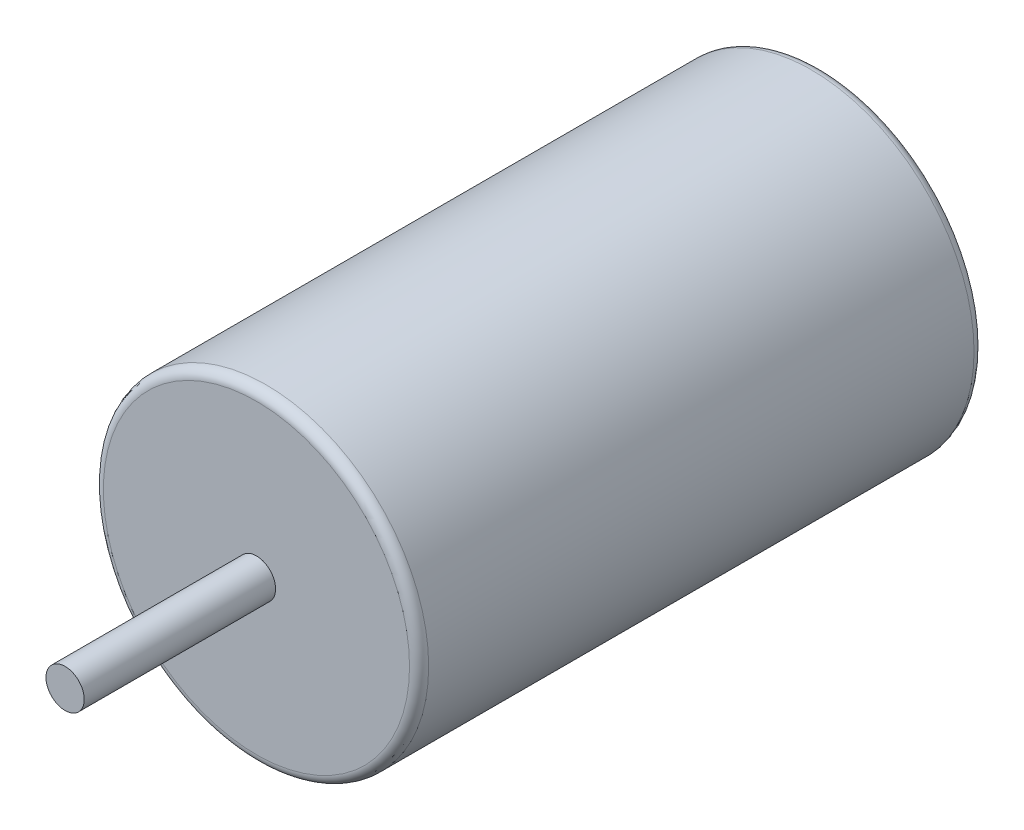
ISO-10303-21;
HEADER;
FILE_DESCRIPTION(('STEP AP214'),'2;1');
FILE_NAME('part.step','',(''),(''),'','','');
FILE_SCHEMA(('AUTOMOTIVE_DESIGN { 1 0 10303 214 1 1 1 1 }'));
ENDSEC;
DATA;
#1=APPLICATION_CONTEXT('core data for automotive mechanical design processes');
#2=APPLICATION_PROTOCOL_DEFINITION('international standard','automotive_design',2000,#1);
#3=PRODUCT_CONTEXT('',#1,'mechanical');
#4=PRODUCT('Part','Part','',(#3));
#5=PRODUCT_RELATED_PRODUCT_CATEGORY('part','',(#4));
#6=PRODUCT_DEFINITION_FORMATION('','',#4);
#7=PRODUCT_DEFINITION_CONTEXT('part definition',#1,'design');
#8=PRODUCT_DEFINITION('design','',#6,#7);
#9=PRODUCT_DEFINITION_SHAPE('','',#8);
#10=(LENGTH_UNIT() NAMED_UNIT(*) SI_UNIT(.MILLI.,.METRE.));
#11=(NAMED_UNIT(*) PLANE_ANGLE_UNIT() SI_UNIT($,.RADIAN.));
#12=(NAMED_UNIT(*) SI_UNIT($,.STERADIAN.) SOLID_ANGLE_UNIT());
#13=UNCERTAINTY_MEASURE_WITH_UNIT(LENGTH_MEASURE(1.E-05),#10,'distance_accuracy_value','');
#14=(GEOMETRIC_REPRESENTATION_CONTEXT(3) GLOBAL_UNCERTAINTY_ASSIGNED_CONTEXT((#13)) GLOBAL_UNIT_ASSIGNED_CONTEXT((#10,
#11,#12)) REPRESENTATION_CONTEXT('',''));
#15=CARTESIAN_POINT('',(0.,0.,0.));
#16=DIRECTION('',(0.,0.,1.));
#17=DIRECTION('',(1.,0.,0.));
#18=AXIS2_PLACEMENT_3D('',#15,#16,#17);
#19=CARTESIAN_POINT('',(0.,0.,118.));
#20=DIRECTION('',(0.,0.,-1.));
#21=DIRECTION('',(-1.,0.,0.));
#22=AXIS2_PLACEMENT_3D('',#19,#20,#21);
#23=CYLINDRICAL_SURFACE('',#22,34.);
#24=CARTESIAN_POINT('',(0.,0.,116.));
#25=DIRECTION('',(0.,0.,1.));
#26=DIRECTION('',(1.,0.,0.));
#27=AXIS2_PLACEMENT_3D('',#24,#25,#26);
#28=CIRCLE('',#27,34.);
#29=CARTESIAN_POINT('',(34.,0.,116.));
#30=VERTEX_POINT('',#29);
#31=EDGE_CURVE('E38',#30,#30,#28,.F.);
#32=ORIENTED_EDGE('',*,*,#31,.T.);
#33=EDGE_LOOP('',(#32));
#34=FACE_BOUND('',#33,.T.);
#35=CARTESIAN_POINT('',(0.,0.,2.));
#36=DIRECTION('',(0.,0.,1.));
#37=DIRECTION('',(1.,0.,0.));
#38=AXIS2_PLACEMENT_3D('',#35,#36,#37);
#39=CIRCLE('',#38,34.);
#40=CARTESIAN_POINT('',(34.,0.,2.));
#41=VERTEX_POINT('',#40);
#42=EDGE_CURVE('E42',#41,#41,#39,.T.);
#43=ORIENTED_EDGE('',*,*,#42,.T.);
#44=EDGE_LOOP('',(#43));
#45=FACE_BOUND('',#44,.T.);
#46=ADVANCED_FACE('F31',(#34,#45),#23,.T.);
#47=CARTESIAN_POINT('',(0.,0.,118.));
#48=DIRECTION('',(0.,0.,1.));
#49=DIRECTION('',(1.,0.,0.));
#50=AXIS2_PLACEMENT_3D('',#47,#48,#49);
#51=PLANE('',#50);
#52=CARTESIAN_POINT('',(0.,0.,118.));
#53=DIRECTION('',(0.,0.,1.));
#54=DIRECTION('',(1.,0.,0.));
#55=AXIS2_PLACEMENT_3D('',#52,#53,#54);
#56=CIRCLE('',#55,32.);
#57=CARTESIAN_POINT('',(32.,0.,118.));
#58=VERTEX_POINT('',#57);
#59=EDGE_CURVE('E46',#58,#58,#56,.T.);
#60=ORIENTED_EDGE('',*,*,#59,.T.);
#61=EDGE_LOOP('',(#60));
#62=FACE_BOUND('',#61,.T.);
#63=CARTESIAN_POINT('',(0.,0.,118.));
#64=DIRECTION('',(0.,0.,1.));
#65=DIRECTION('',(1.,0.,0.));
#66=AXIS2_PLACEMENT_3D('',#63,#64,#65);
#67=CIRCLE('',#66,4.);
#68=CARTESIAN_POINT('',(4.,0.,118.));
#69=VERTEX_POINT('',#68);
#70=EDGE_CURVE('E52',#69,#69,#67,.T.);
#71=ORIENTED_EDGE('',*,*,#70,.F.);
#72=EDGE_LOOP('',(#71));
#73=FACE_BOUND('',#72,.T.);
#74=ADVANCED_FACE('F67',(#62,#73),#51,.T.);
#75=CARTESIAN_POINT('',(0.,0.,0.));
#76=DIRECTION('',(0.,0.,1.));
#77=DIRECTION('',(1.,0.,0.));
#78=AXIS2_PLACEMENT_3D('',#75,#76,#77);
#79=PLANE('',#78);
#80=CARTESIAN_POINT('',(0.,0.,0.));
#81=DIRECTION('',(0.,0.,1.));
#82=DIRECTION('',(1.,0.,0.));
#83=AXIS2_PLACEMENT_3D('',#80,#81,#82);
#84=CIRCLE('',#83,32.);
#85=CARTESIAN_POINT('',(32.,0.,0.));
#86=VERTEX_POINT('',#85);
#87=EDGE_CURVE('E10',#86,#86,#84,.F.);
#88=ORIENTED_EDGE('',*,*,#87,.T.);
#89=EDGE_LOOP('',(#88));
#90=FACE_BOUND('',#89,.T.);
#91=ADVANCED_FACE('F63',(#90),#79,.F.);
#92=CARTESIAN_POINT('',(0.,0.,158.));
#93=DIRECTION('',(0.,0.,-1.));
#94=DIRECTION('',(-1.,0.,0.));
#95=AXIS2_PLACEMENT_3D('',#92,#93,#94);
#96=CYLINDRICAL_SURFACE('',#95,4.);
#97=CARTESIAN_POINT('',(0.,0.,158.));
#98=DIRECTION('',(0.,0.,1.));
#99=DIRECTION('',(1.,0.,0.));
#100=AXIS2_PLACEMENT_3D('',#97,#98,#99);
#101=CIRCLE('',#100,4.);
#102=CARTESIAN_POINT('',(4.,0.,158.));
#103=VERTEX_POINT('',#102);
#104=EDGE_CURVE('E51',#103,#103,#101,.T.);
#105=ORIENTED_EDGE('',*,*,#104,.F.);
#106=EDGE_LOOP('',(#105));
#107=FACE_BOUND('',#106,.T.);
#108=ORIENTED_EDGE('',*,*,#70,.T.);
#109=EDGE_LOOP('',(#108));
#110=FACE_BOUND('',#109,.T.);
#111=ADVANCED_FACE('F60',(#107,#110),#96,.T.);
#112=CARTESIAN_POINT('',(0.,0.,158.));
#113=DIRECTION('',(0.,0.,1.));
#114=DIRECTION('',(1.,0.,0.));
#115=AXIS2_PLACEMENT_3D('',#112,#113,#114);
#116=PLANE('',#115);
#117=ORIENTED_EDGE('',*,*,#104,.T.);
#118=EDGE_LOOP('',(#117));
#119=FACE_BOUND('',#118,.T.);
#120=ADVANCED_FACE('F58',(#119),#116,.T.);
#121=CARTESIAN_POINT('',(0.,0.,116.));
#122=DIRECTION('',(0.,0.,1.));
#123=DIRECTION('',(1.,0.,0.));
#124=AXIS2_PLACEMENT_3D('',#121,#122,#123);
#125=TOROIDAL_SURFACE('',#124,32.,2.);
#126=ORIENTED_EDGE('',*,*,#31,.F.);
#127=EDGE_LOOP('',(#126));
#128=FACE_BOUND('',#127,.T.);
#129=ORIENTED_EDGE('',*,*,#59,.F.);
#130=EDGE_LOOP('',(#129));
#131=FACE_BOUND('',#130,.T.);
#132=ADVANCED_FACE('F78',(#128,#131),#125,.T.);
#133=CARTESIAN_POINT('',(0.,0.,2.));
#134=DIRECTION('',(0.,0.,1.));
#135=DIRECTION('',(1.,0.,0.));
#136=AXIS2_PLACEMENT_3D('',#133,#134,#135);
#137=TOROIDAL_SURFACE('',#136,32.,2.);
#138=ORIENTED_EDGE('',*,*,#87,.F.);
#139=EDGE_LOOP('',(#138));
#140=FACE_BOUND('',#139,.T.);
#141=ORIENTED_EDGE('',*,*,#42,.F.);
#142=EDGE_LOOP('',(#141));
#143=FACE_BOUND('',#142,.T.);
#144=ADVANCED_FACE('F33',(#140,#143),#137,.T.);
#145=CLOSED_SHELL('',(#46,#74,#91,#111,#120,#132,#144));
#146=MANIFOLD_SOLID_BREP('B2',#145);
#147=ADVANCED_BREP_SHAPE_REPRESENTATION('',(#18,#146),#14);
#148=SHAPE_DEFINITION_REPRESENTATION(#9,#147);
ENDSEC;
END-ISO-10303-21;
